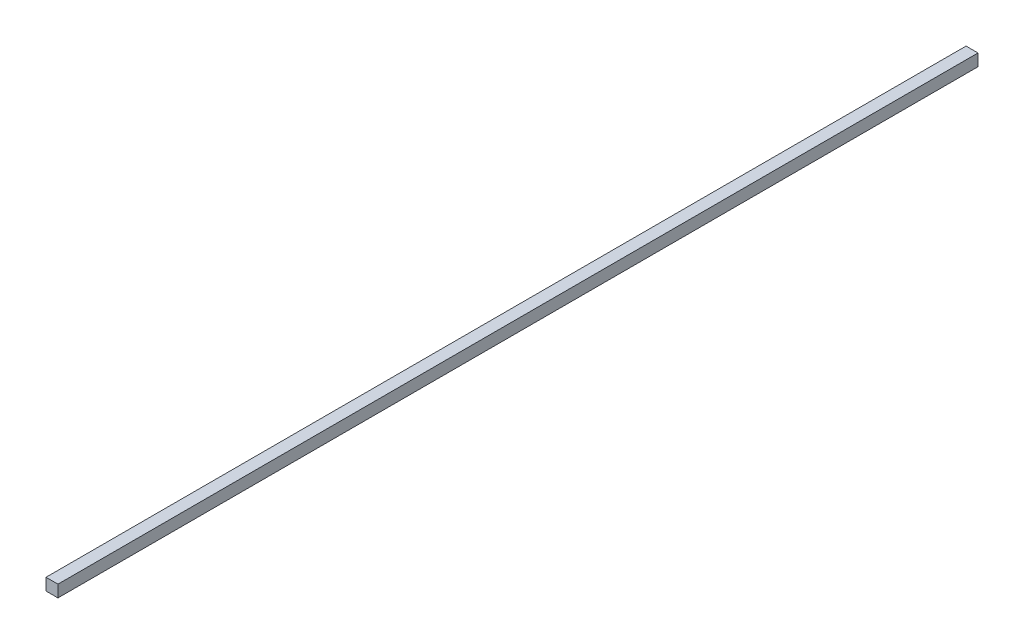
ISO-10303-21;
HEADER;
FILE_DESCRIPTION(('STEP AP214'),'2;1');
FILE_NAME('part.step','',(''),(''),'','','');
FILE_SCHEMA(('AUTOMOTIVE_DESIGN { 1 0 10303 214 1 1 1 1 }'));
ENDSEC;
DATA;
#1=APPLICATION_CONTEXT('core data for automotive mechanical design processes');
#2=APPLICATION_PROTOCOL_DEFINITION('international standard','automotive_design',2000,#1);
#3=PRODUCT_CONTEXT('',#1,'mechanical');
#4=PRODUCT('Part','Part','',(#3));
#5=PRODUCT_RELATED_PRODUCT_CATEGORY('part','',(#4));
#6=PRODUCT_DEFINITION_FORMATION('','',#4);
#7=PRODUCT_DEFINITION_CONTEXT('part definition',#1,'design');
#8=PRODUCT_DEFINITION('design','',#6,#7);
#9=PRODUCT_DEFINITION_SHAPE('','',#8);
#10=(LENGTH_UNIT() NAMED_UNIT(*) SI_UNIT(.MILLI.,.METRE.));
#11=(NAMED_UNIT(*) PLANE_ANGLE_UNIT() SI_UNIT($,.RADIAN.));
#12=(NAMED_UNIT(*) SI_UNIT($,.STERADIAN.) SOLID_ANGLE_UNIT());
#13=UNCERTAINTY_MEASURE_WITH_UNIT(LENGTH_MEASURE(1.E-05),#10,'distance_accuracy_value','');
#14=(GEOMETRIC_REPRESENTATION_CONTEXT(3) GLOBAL_UNCERTAINTY_ASSIGNED_CONTEXT((#13)) GLOBAL_UNIT_ASSIGNED_CONTEXT((#10,
#11,#12)) REPRESENTATION_CONTEXT('',''));
#15=CARTESIAN_POINT('',(0.,0.,0.));
#16=DIRECTION('',(0.,0.,1.));
#17=DIRECTION('',(1.,0.,0.));
#18=AXIS2_PLACEMENT_3D('',#15,#16,#17);
#19=CARTESIAN_POINT('',(-43.25,14.25,770.));
#20=DIRECTION('',(1.,0.,0.));
#21=DIRECTION('',(0.,0.,-1.));
#22=AXIS2_PLACEMENT_3D('',#19,#20,#21);
#23=PLANE('',#22);
#24=DIRECTION('',(0.,-1.,0.));
#25=VECTOR('',#24,1.);
#26=CARTESIAN_POINT('',(-43.25,14.25,0.));
#27=LINE('',#26,#25);
#28=CARTESIAN_POINT('',(-43.25,14.25,0.));
#29=VERTEX_POINT('',#28);
#30=CARTESIAN_POINT('',(-43.25,4.25,0.));
#31=VERTEX_POINT('',#30);
#32=EDGE_CURVE('E107',#29,#31,#27,.T.);
#33=ORIENTED_EDGE('',*,*,#32,.T.);
#34=DIRECTION('',(0.,0.,-1.));
#35=VECTOR('',#34,1.);
#36=CARTESIAN_POINT('',(-43.25,4.25,770.));
#37=LINE('',#36,#35);
#38=CARTESIAN_POINT('',(-43.25,4.25,770.));
#39=VERTEX_POINT('',#38);
#40=EDGE_CURVE('E11',#39,#31,#37,.T.);
#41=ORIENTED_EDGE('',*,*,#40,.F.);
#42=DIRECTION('',(0.,-1.,0.));
#43=VECTOR('',#42,1.);
#44=CARTESIAN_POINT('',(-43.25,14.25,770.));
#45=LINE('',#44,#43);
#46=CARTESIAN_POINT('',(-43.25,14.25,770.));
#47=VERTEX_POINT('',#46);
#48=EDGE_CURVE('E91',#47,#39,#45,.T.);
#49=ORIENTED_EDGE('',*,*,#48,.F.);
#50=DIRECTION('',(0.,0.,-1.));
#51=VECTOR('',#50,1.);
#52=CARTESIAN_POINT('',(-43.25,14.25,770.));
#53=LINE('',#52,#51);
#54=EDGE_CURVE('E103',#47,#29,#53,.T.);
#55=ORIENTED_EDGE('',*,*,#54,.T.);
#56=EDGE_LOOP('',(#33,#41,#49,#55));
#57=FACE_BOUND('',#56,.T.);
#58=ADVANCED_FACE('F39',(#57),#23,.F.);
#59=CARTESIAN_POINT('',(-43.25,4.25,770.));
#60=DIRECTION('',(0.,1.,0.));
#61=DIRECTION('',(0.,0.,1.));
#62=AXIS2_PLACEMENT_3D('',#59,#60,#61);
#63=PLANE('',#62);
#64=DIRECTION('',(1.,0.,0.));
#65=VECTOR('',#64,1.);
#66=CARTESIAN_POINT('',(-43.25,4.25,0.));
#67=LINE('',#66,#65);
#68=CARTESIAN_POINT('',(-33.25,4.25,0.));
#69=VERTEX_POINT('',#68);
#70=EDGE_CURVE('E96',#31,#69,#67,.T.);
#71=ORIENTED_EDGE('',*,*,#70,.T.);
#72=DIRECTION('',(0.,0.,-1.));
#73=VECTOR('',#72,1.);
#74=CARTESIAN_POINT('',(-33.25,4.25,770.));
#75=LINE('',#74,#73);
#76=CARTESIAN_POINT('',(-33.25,4.25,770.));
#77=VERTEX_POINT('',#76);
#78=EDGE_CURVE('E48',#77,#69,#75,.T.);
#79=ORIENTED_EDGE('',*,*,#78,.F.);
#80=DIRECTION('',(1.,0.,0.));
#81=VECTOR('',#80,1.);
#82=CARTESIAN_POINT('',(-43.25,4.25,770.));
#83=LINE('',#82,#81);
#84=EDGE_CURVE('E86',#39,#77,#83,.T.);
#85=ORIENTED_EDGE('',*,*,#84,.F.);
#86=ORIENTED_EDGE('',*,*,#40,.T.);
#87=EDGE_LOOP('',(#71,#79,#85,#86));
#88=FACE_BOUND('',#87,.T.);
#89=ADVANCED_FACE('F95',(#88),#63,.F.);
#90=CARTESIAN_POINT('',(-33.25,14.25,770.));
#91=DIRECTION('',(-1.,0.,0.));
#92=DIRECTION('',(0.,0.,1.));
#93=AXIS2_PLACEMENT_3D('',#90,#91,#92);
#94=PLANE('',#93);
#95=DIRECTION('',(0.,1.,0.));
#96=VECTOR('',#95,1.);
#97=CARTESIAN_POINT('',(-33.25,14.25,0.));
#98=LINE('',#97,#96);
#99=CARTESIAN_POINT('',(-33.25,14.25,0.));
#100=VERTEX_POINT('',#99);
#101=EDGE_CURVE('E73',#69,#100,#98,.T.);
#102=ORIENTED_EDGE('',*,*,#101,.T.);
#103=DIRECTION('',(0.,0.,-1.));
#104=VECTOR('',#103,1.);
#105=CARTESIAN_POINT('',(-33.25,14.25,770.));
#106=LINE('',#105,#104);
#107=CARTESIAN_POINT('',(-33.25,14.25,770.));
#108=VERTEX_POINT('',#107);
#109=EDGE_CURVE('E98',#108,#100,#106,.T.);
#110=ORIENTED_EDGE('',*,*,#109,.F.);
#111=DIRECTION('',(0.,1.,0.));
#112=VECTOR('',#111,1.);
#113=CARTESIAN_POINT('',(-33.25,14.25,770.));
#114=LINE('',#113,#112);
#115=EDGE_CURVE('E89',#77,#108,#114,.T.);
#116=ORIENTED_EDGE('',*,*,#115,.F.);
#117=ORIENTED_EDGE('',*,*,#78,.T.);
#118=EDGE_LOOP('',(#102,#110,#116,#117));
#119=FACE_BOUND('',#118,.T.);
#120=ADVANCED_FACE('F99',(#119),#94,.F.);
#121=CARTESIAN_POINT('',(-43.25,14.25,770.));
#122=DIRECTION('',(0.,-1.,0.));
#123=DIRECTION('',(0.,0.,-1.));
#124=AXIS2_PLACEMENT_3D('',#121,#122,#123);
#125=PLANE('',#124);
#126=DIRECTION('',(-1.,0.,0.));
#127=VECTOR('',#126,1.);
#128=CARTESIAN_POINT('',(-43.25,14.25,0.));
#129=LINE('',#128,#127);
#130=EDGE_CURVE('E79',#100,#29,#129,.T.);
#131=ORIENTED_EDGE('',*,*,#130,.T.);
#132=ORIENTED_EDGE('',*,*,#54,.F.);
#133=DIRECTION('',(-1.,0.,0.));
#134=VECTOR('',#133,1.);
#135=CARTESIAN_POINT('',(-43.25,14.25,770.));
#136=LINE('',#135,#134);
#137=EDGE_CURVE('E56',#108,#47,#136,.T.);
#138=ORIENTED_EDGE('',*,*,#137,.F.);
#139=ORIENTED_EDGE('',*,*,#109,.T.);
#140=EDGE_LOOP('',(#131,#132,#138,#139));
#141=FACE_BOUND('',#140,.T.);
#142=ADVANCED_FACE('F120',(#141),#125,.F.);
#143=CARTESIAN_POINT('',(0.,0.,770.));
#144=DIRECTION('',(0.,0.,1.));
#145=DIRECTION('',(1.,0.,0.));
#146=AXIS2_PLACEMENT_3D('',#143,#144,#145);
#147=PLANE('',#146);
#148=ORIENTED_EDGE('',*,*,#48,.T.);
#149=ORIENTED_EDGE('',*,*,#84,.T.);
#150=ORIENTED_EDGE('',*,*,#115,.T.);
#151=ORIENTED_EDGE('',*,*,#137,.T.);
#152=EDGE_LOOP('',(#148,#149,#150,#151));
#153=FACE_BOUND('',#152,.T.);
#154=ADVANCED_FACE('F87',(#153),#147,.T.);
#155=CARTESIAN_POINT('',(0.,0.,0.));
#156=DIRECTION('',(0.,0.,1.));
#157=DIRECTION('',(1.,0.,0.));
#158=AXIS2_PLACEMENT_3D('',#155,#156,#157);
#159=PLANE('',#158);
#160=ORIENTED_EDGE('',*,*,#32,.F.);
#161=ORIENTED_EDGE('',*,*,#130,.F.);
#162=ORIENTED_EDGE('',*,*,#101,.F.);
#163=ORIENTED_EDGE('',*,*,#70,.F.);
#164=EDGE_LOOP('',(#160,#161,#162,#163));
#165=FACE_BOUND('',#164,.T.);
#166=ADVANCED_FACE('F123',(#165),#159,.F.);
#167=CLOSED_SHELL('',(#58,#89,#120,#142,#154,#166));
#168=MANIFOLD_SOLID_BREP('B2',#167);
#169=ADVANCED_BREP_SHAPE_REPRESENTATION('',(#18,#168),#14);
#170=SHAPE_DEFINITION_REPRESENTATION(#9,#169);
ENDSEC;
END-ISO-10303-21;
